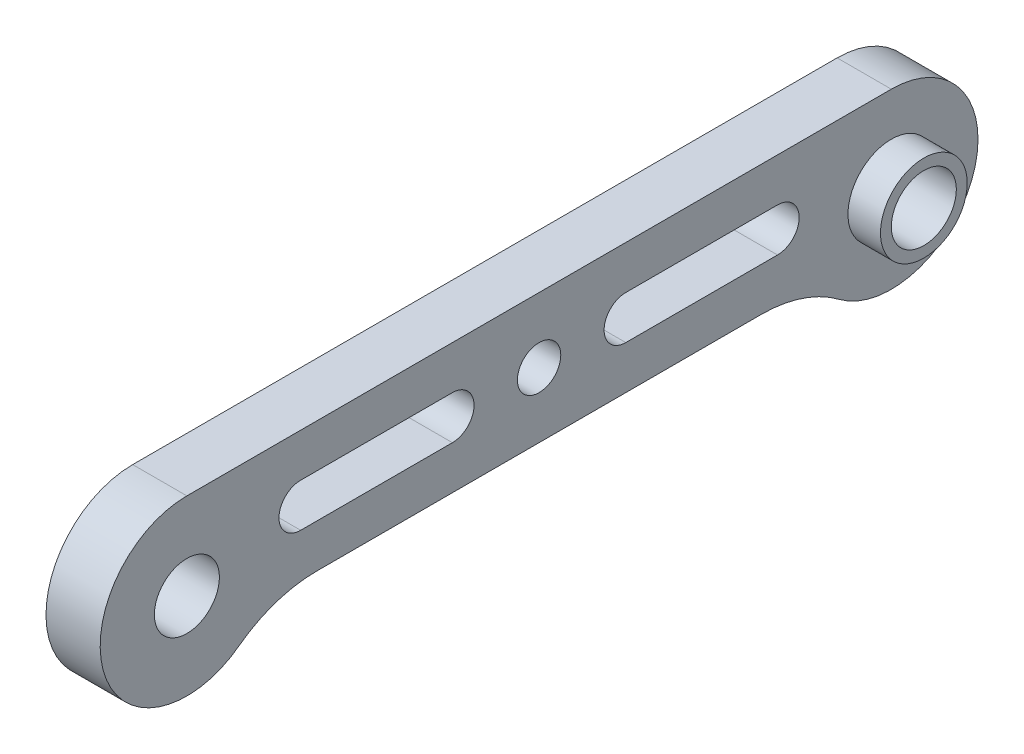
ISO-10303-21;
HEADER;
FILE_DESCRIPTION(('STEP AP214'),'2;1');
FILE_NAME('part.step','',(''),(''),'','','');
FILE_SCHEMA(('AUTOMOTIVE_DESIGN { 1 0 10303 214 1 1 1 1 }'));
ENDSEC;
DATA;
#1=APPLICATION_CONTEXT('core data for automotive mechanical design processes');
#2=APPLICATION_PROTOCOL_DEFINITION('international standard','automotive_design',2000,#1);
#3=PRODUCT_CONTEXT('',#1,'mechanical');
#4=PRODUCT('Part','Part','',(#3));
#5=PRODUCT_RELATED_PRODUCT_CATEGORY('part','',(#4));
#6=PRODUCT_DEFINITION_FORMATION('','',#4);
#7=PRODUCT_DEFINITION_CONTEXT('part definition',#1,'design');
#8=PRODUCT_DEFINITION('design','',#6,#7);
#9=PRODUCT_DEFINITION_SHAPE('','',#8);
#10=(LENGTH_UNIT() NAMED_UNIT(*) SI_UNIT(.MILLI.,.METRE.));
#11=(NAMED_UNIT(*) PLANE_ANGLE_UNIT() SI_UNIT($,.RADIAN.));
#12=(NAMED_UNIT(*) SI_UNIT($,.STERADIAN.) SOLID_ANGLE_UNIT());
#13=UNCERTAINTY_MEASURE_WITH_UNIT(LENGTH_MEASURE(1.E-05),#10,'distance_accuracy_value','');
#14=(GEOMETRIC_REPRESENTATION_CONTEXT(3) GLOBAL_UNCERTAINTY_ASSIGNED_CONTEXT((#13)) GLOBAL_UNIT_ASSIGNED_CONTEXT((#10,
#11,#12)) REPRESENTATION_CONTEXT('',''));
#15=CARTESIAN_POINT('',(0.,0.,0.));
#16=DIRECTION('',(0.,0.,1.));
#17=DIRECTION('',(1.,0.,0.));
#18=AXIS2_PLACEMENT_3D('',#15,#16,#17);
#19=CARTESIAN_POINT('',(5.,0.,0.));
#20=DIRECTION('',(1.,0.,0.));
#21=DIRECTION('',(0.,0.,-1.));
#22=AXIS2_PLACEMENT_3D('',#19,#20,#21);
#23=PLANE('',#22);
#24=DIRECTION('',(0.,0.,1.));
#25=VECTOR('',#24,1.);
#26=CARTESIAN_POINT('',(5.,-4.,0.));
#27=LINE('',#26,#25);
#28=CARTESIAN_POINT('',(5.,-4.,12.));
#29=VERTEX_POINT('',#28);
#30=CARTESIAN_POINT('',(5.,-4.00000000000001,53.));
#31=VERTEX_POINT('',#30);
#32=EDGE_CURVE('E239',#29,#31,#27,.T.);
#33=ORIENTED_EDGE('',*,*,#32,.F.);
#34=CARTESIAN_POINT('',(5.,-16.,12.));
#35=DIRECTION('',(1.,0.,0.));
#36=DIRECTION('',(0.,0.,-1.));
#37=AXIS2_PLACEMENT_3D('',#34,#35,#36);
#38=CIRCLE('',#37,12.);
#39=CARTESIAN_POINT('',(5.,-6.4,4.8));
#40=VERTEX_POINT('',#39);
#41=EDGE_CURVE('E296',#29,#40,#38,.F.);
#42=ORIENTED_EDGE('',*,*,#41,.T.);
#43=CARTESIAN_POINT('',(5.,0.,0.));
#44=DIRECTION('',(1.,0.,0.));
#45=DIRECTION('',(0.,0.,-1.));
#46=AXIS2_PLACEMENT_3D('',#43,#44,#45);
#47=CIRCLE('',#46,8.);
#48=CARTESIAN_POINT('',(5.,8.,0.));
#49=VERTEX_POINT('',#48);
#50=EDGE_CURVE('E244',#40,#49,#47,.T.);
#51=ORIENTED_EDGE('',*,*,#50,.T.);
#52=DIRECTION('',(0.,0.,-1.));
#53=VECTOR('',#52,1.);
#54=CARTESIAN_POINT('',(5.,8.,0.));
#55=LINE('',#54,#53);
#56=CARTESIAN_POINT('',(5.,7.99999999999999,65.));
#57=VERTEX_POINT('',#56);
#58=EDGE_CURVE('E247',#57,#49,#55,.T.);
#59=ORIENTED_EDGE('',*,*,#58,.F.);
#60=CARTESIAN_POINT('',(5.,0.,65.));
#61=DIRECTION('',(1.,0.,0.));
#62=DIRECTION('',(0.,0.,-1.));
#63=AXIS2_PLACEMENT_3D('',#60,#61,#62);
#64=CIRCLE('',#63,8.);
#65=CARTESIAN_POINT('',(5.,-6.40000000000001,60.2));
#66=VERTEX_POINT('',#65);
#67=EDGE_CURVE('E251',#57,#66,#64,.T.);
#68=ORIENTED_EDGE('',*,*,#67,.T.);
#69=CARTESIAN_POINT('',(5.,-16.,53.));
#70=DIRECTION('',(1.,0.,0.));
#71=DIRECTION('',(0.,0.,-1.));
#72=AXIS2_PLACEMENT_3D('',#69,#70,#71);
#73=CIRCLE('',#72,12.);
#74=EDGE_CURVE('E50',#66,#31,#73,.F.);
#75=ORIENTED_EDGE('',*,*,#74,.T.);
#76=EDGE_LOOP('',(#33,#42,#51,#59,#68,#75));
#77=FACE_BOUND('',#76,.T.);
#78=CARTESIAN_POINT('',(5.,0.,65.));
#79=DIRECTION('',(1.,0.,0.));
#80=DIRECTION('',(0.,0.,-1.));
#81=AXIS2_PLACEMENT_3D('',#78,#79,#80);
#82=CIRCLE('',#81,3.00000000000001);
#83=CARTESIAN_POINT('',(5.,0.,62.));
#84=VERTEX_POINT('',#83);
#85=EDGE_CURVE('E235',#84,#84,#82,.T.);
#86=ORIENTED_EDGE('',*,*,#85,.F.);
#87=EDGE_LOOP('',(#86));
#88=FACE_BOUND('',#87,.T.);
#89=CARTESIAN_POINT('',(5.,1.99999999999999,32.5));
#90=DIRECTION('',(1.,0.,0.));
#91=DIRECTION('',(0.,0.,-1.));
#92=AXIS2_PLACEMENT_3D('',#89,#90,#91);
#93=CIRCLE('',#92,2.);
#94=CARTESIAN_POINT('',(5.,1.99999999999999,30.5));
#95=VERTEX_POINT('',#94);
#96=EDGE_CURVE('E185',#95,#95,#93,.T.);
#97=ORIENTED_EDGE('',*,*,#96,.F.);
#98=EDGE_LOOP('',(#97));
#99=FACE_BOUND('',#98,.T.);
#100=CARTESIAN_POINT('',(5.,1.99999999999999,54.5));
#101=DIRECTION('',(1.,0.,0.));
#102=DIRECTION('',(0.,0.,-1.));
#103=AXIS2_PLACEMENT_3D('',#100,#101,#102);
#104=CIRCLE('',#103,2.);
#105=CARTESIAN_POINT('',(5.,3.99999999999999,54.5));
#106=VERTEX_POINT('',#105);
#107=CARTESIAN_POINT('',(5.,0.,54.5));
#108=VERTEX_POINT('',#107);
#109=EDGE_CURVE('E65',#106,#108,#104,.T.);
#110=ORIENTED_EDGE('',*,*,#109,.F.);
#111=DIRECTION('',(0.,0.,1.));
#112=VECTOR('',#111,1.);
#113=CARTESIAN_POINT('',(5.,3.99999999999999,54.5));
#114=LINE('',#113,#112);
#115=CARTESIAN_POINT('',(5.,3.99999999999999,40.5));
#116=VERTEX_POINT('',#115);
#117=EDGE_CURVE('E168',#116,#106,#114,.T.);
#118=ORIENTED_EDGE('',*,*,#117,.F.);
#119=CARTESIAN_POINT('',(5.,1.99999999999999,40.5));
#120=DIRECTION('',(1.,0.,0.));
#121=DIRECTION('',(0.,0.,-1.));
#122=AXIS2_PLACEMENT_3D('',#119,#120,#121);
#123=CIRCLE('',#122,2.);
#124=CARTESIAN_POINT('',(5.,0.,40.5));
#125=VERTEX_POINT('',#124);
#126=EDGE_CURVE('E150',#125,#116,#123,.T.);
#127=ORIENTED_EDGE('',*,*,#126,.F.);
#128=DIRECTION('',(0.,0.,-1.));
#129=VECTOR('',#128,1.);
#130=CARTESIAN_POINT('',(5.,0.,54.5));
#131=LINE('',#130,#129);
#132=EDGE_CURVE('E161',#108,#125,#131,.T.);
#133=ORIENTED_EDGE('',*,*,#132,.F.);
#134=EDGE_LOOP('',(#110,#118,#127,#133));
#135=FACE_BOUND('',#134,.T.);
#136=CARTESIAN_POINT('',(5.,1.99999999999999,24.5));
#137=DIRECTION('',(1.,0.,0.));
#138=DIRECTION('',(0.,0.,-1.));
#139=AXIS2_PLACEMENT_3D('',#136,#137,#138);
#140=CIRCLE('',#139,2.);
#141=CARTESIAN_POINT('',(5.,3.99999999999999,24.5));
#142=VERTEX_POINT('',#141);
#143=CARTESIAN_POINT('',(5.,0.,24.5));
#144=VERTEX_POINT('',#143);
#145=EDGE_CURVE('E57',#142,#144,#140,.T.);
#146=ORIENTED_EDGE('',*,*,#145,.F.);
#147=DIRECTION('',(0.,0.,1.));
#148=VECTOR('',#147,1.);
#149=CARTESIAN_POINT('',(5.,3.99999999999999,24.5));
#150=LINE('',#149,#148);
#151=CARTESIAN_POINT('',(5.,3.99999999999999,10.5));
#152=VERTEX_POINT('',#151);
#153=EDGE_CURVE('E210',#152,#142,#150,.T.);
#154=ORIENTED_EDGE('',*,*,#153,.F.);
#155=CARTESIAN_POINT('',(5.,1.99999999999999,10.5));
#156=DIRECTION('',(1.,0.,0.));
#157=DIRECTION('',(0.,0.,-1.));
#158=AXIS2_PLACEMENT_3D('',#155,#156,#157);
#159=CIRCLE('',#158,2.);
#160=CARTESIAN_POINT('',(5.,0.,10.5));
#161=VERTEX_POINT('',#160);
#162=EDGE_CURVE('E206',#161,#152,#159,.T.);
#163=ORIENTED_EDGE('',*,*,#162,.F.);
#164=DIRECTION('',(0.,0.,-1.));
#165=VECTOR('',#164,1.);
#166=CARTESIAN_POINT('',(5.,0.,24.5));
#167=LINE('',#166,#165);
#168=EDGE_CURVE('E201',#144,#161,#167,.T.);
#169=ORIENTED_EDGE('',*,*,#168,.F.);
#170=EDGE_LOOP('',(#146,#154,#163,#169));
#171=FACE_BOUND('',#170,.T.);
#172=CARTESIAN_POINT('',(5.,0.,0.));
#173=DIRECTION('',(1.,0.,0.));
#174=DIRECTION('',(0.,0.,-1.));
#175=AXIS2_PLACEMENT_3D('',#172,#173,#174);
#176=CIRCLE('',#175,4.);
#177=CARTESIAN_POINT('',(5.,0.,-4.));
#178=VERTEX_POINT('',#177);
#179=EDGE_CURVE('E373',#178,#178,#176,.T.);
#180=ORIENTED_EDGE('',*,*,#179,.F.);
#181=EDGE_LOOP('',(#180));
#182=FACE_BOUND('',#181,.T.);
#183=ADVANCED_FACE('F41',(#77,#88,#99,#135,#171,#182),#23,.T.);
#184=CARTESIAN_POINT('',(0.,0.,0.));
#185=DIRECTION('',(1.,0.,0.));
#186=DIRECTION('',(0.,0.,-1.));
#187=AXIS2_PLACEMENT_3D('',#184,#185,#186);
#188=PLANE('',#187);
#189=CARTESIAN_POINT('',(0.,0.,0.));
#190=DIRECTION('',(1.,0.,0.));
#191=DIRECTION('',(0.,0.,-1.));
#192=AXIS2_PLACEMENT_3D('',#189,#190,#191);
#193=CIRCLE('',#192,8.);
#194=CARTESIAN_POINT('',(0.,-6.4,4.8));
#195=VERTEX_POINT('',#194);
#196=CARTESIAN_POINT('',(0.,8.,0.));
#197=VERTEX_POINT('',#196);
#198=EDGE_CURVE('E263',#195,#197,#193,.T.);
#199=ORIENTED_EDGE('',*,*,#198,.F.);
#200=CARTESIAN_POINT('',(0.,-16.,12.));
#201=DIRECTION('',(1.,0.,0.));
#202=DIRECTION('',(0.,0.,-1.));
#203=AXIS2_PLACEMENT_3D('',#200,#201,#202);
#204=CIRCLE('',#203,12.);
#205=CARTESIAN_POINT('',(0.,-4.,12.));
#206=VERTEX_POINT('',#205);
#207=EDGE_CURVE('E293',#195,#206,#204,.T.);
#208=ORIENTED_EDGE('',*,*,#207,.T.);
#209=DIRECTION('',(0.,0.,1.));
#210=VECTOR('',#209,1.);
#211=CARTESIAN_POINT('',(0.,-4.,0.));
#212=LINE('',#211,#210);
#213=CARTESIAN_POINT('',(0.,-4.00000000000001,53.));
#214=VERTEX_POINT('',#213);
#215=EDGE_CURVE('E259',#206,#214,#212,.T.);
#216=ORIENTED_EDGE('',*,*,#215,.T.);
#217=CARTESIAN_POINT('',(0.,-16.,53.));
#218=DIRECTION('',(1.,0.,0.));
#219=DIRECTION('',(0.,0.,-1.));
#220=AXIS2_PLACEMENT_3D('',#217,#218,#219);
#221=CIRCLE('',#220,12.);
#222=CARTESIAN_POINT('',(0.,-6.40000000000001,60.2));
#223=VERTEX_POINT('',#222);
#224=EDGE_CURVE('E299',#214,#223,#221,.T.);
#225=ORIENTED_EDGE('',*,*,#224,.T.);
#226=CARTESIAN_POINT('',(0.,0.,65.));
#227=DIRECTION('',(1.,0.,0.));
#228=DIRECTION('',(0.,0.,-1.));
#229=AXIS2_PLACEMENT_3D('',#226,#227,#228);
#230=CIRCLE('',#229,8.);
#231=CARTESIAN_POINT('',(0.,7.99999999999999,65.));
#232=VERTEX_POINT('',#231);
#233=EDGE_CURVE('E240',#232,#223,#230,.T.);
#234=ORIENTED_EDGE('',*,*,#233,.F.);
#235=DIRECTION('',(0.,0.,-1.));
#236=VECTOR('',#235,1.);
#237=CARTESIAN_POINT('',(0.,8.,0.));
#238=LINE('',#237,#236);
#239=EDGE_CURVE('E266',#232,#197,#238,.T.);
#240=ORIENTED_EDGE('',*,*,#239,.T.);
#241=EDGE_LOOP('',(#199,#208,#216,#225,#234,#240));
#242=FACE_BOUND('',#241,.T.);
#243=CARTESIAN_POINT('',(0.,0.,65.));
#244=DIRECTION('',(1.,0.,0.));
#245=DIRECTION('',(0.,0.,-1.));
#246=AXIS2_PLACEMENT_3D('',#243,#244,#245);
#247=CIRCLE('',#246,3.00000000000001);
#248=CARTESIAN_POINT('',(0.,0.,62.));
#249=VERTEX_POINT('',#248);
#250=EDGE_CURVE('E234',#249,#249,#247,.T.);
#251=ORIENTED_EDGE('',*,*,#250,.T.);
#252=EDGE_LOOP('',(#251));
#253=FACE_BOUND('',#252,.T.);
#254=CARTESIAN_POINT('',(0.,1.99999999999999,32.5));
#255=DIRECTION('',(1.,0.,0.));
#256=DIRECTION('',(0.,0.,-1.));
#257=AXIS2_PLACEMENT_3D('',#254,#255,#256);
#258=CIRCLE('',#257,2.);
#259=CARTESIAN_POINT('',(0.,1.99999999999999,30.5));
#260=VERTEX_POINT('',#259);
#261=EDGE_CURVE('E230',#260,#260,#258,.F.);
#262=ORIENTED_EDGE('',*,*,#261,.F.);
#263=EDGE_LOOP('',(#262));
#264=FACE_BOUND('',#263,.T.);
#265=DIRECTION('',(0.,0.,-1.));
#266=VECTOR('',#265,1.);
#267=CARTESIAN_POINT('',(0.,3.99999999999999,54.5));
#268=LINE('',#267,#266);
#269=CARTESIAN_POINT('',(0.,3.99999999999999,54.5));
#270=VERTEX_POINT('',#269);
#271=CARTESIAN_POINT('',(0.,3.99999999999999,40.5));
#272=VERTEX_POINT('',#271);
#273=EDGE_CURVE('E390',#270,#272,#268,.T.);
#274=ORIENTED_EDGE('',*,*,#273,.F.);
#275=CARTESIAN_POINT('',(0.,1.99999999999999,54.5));
#276=DIRECTION('',(1.,0.,0.));
#277=DIRECTION('',(0.,0.,-1.));
#278=AXIS2_PLACEMENT_3D('',#275,#276,#277);
#279=CIRCLE('',#278,2.);
#280=CARTESIAN_POINT('',(0.,0.,54.5));
#281=VERTEX_POINT('',#280);
#282=EDGE_CURVE('E186',#281,#270,#279,.F.);
#283=ORIENTED_EDGE('',*,*,#282,.F.);
#284=DIRECTION('',(0.,0.,1.));
#285=VECTOR('',#284,1.);
#286=CARTESIAN_POINT('',(0.,0.,54.5));
#287=LINE('',#286,#285);
#288=CARTESIAN_POINT('',(0.,0.,40.5));
#289=VERTEX_POINT('',#288);
#290=EDGE_CURVE('E182',#289,#281,#287,.T.);
#291=ORIENTED_EDGE('',*,*,#290,.F.);
#292=CARTESIAN_POINT('',(0.,1.99999999999999,40.5));
#293=DIRECTION('',(1.,0.,0.));
#294=DIRECTION('',(0.,0.,-1.));
#295=AXIS2_PLACEMENT_3D('',#292,#293,#294);
#296=CIRCLE('',#295,2.);
#297=EDGE_CURVE('E153',#272,#289,#296,.F.);
#298=ORIENTED_EDGE('',*,*,#297,.F.);
#299=EDGE_LOOP('',(#274,#283,#291,#298));
#300=FACE_BOUND('',#299,.T.);
#301=DIRECTION('',(0.,0.,-1.));
#302=VECTOR('',#301,1.);
#303=CARTESIAN_POINT('',(0.,3.99999999999999,24.5));
#304=LINE('',#303,#302);
#305=CARTESIAN_POINT('',(0.,3.99999999999999,24.5));
#306=VERTEX_POINT('',#305);
#307=CARTESIAN_POINT('',(0.,3.99999999999999,10.5));
#308=VERTEX_POINT('',#307);
#309=EDGE_CURVE('E191',#306,#308,#304,.T.);
#310=ORIENTED_EDGE('',*,*,#309,.F.);
#311=CARTESIAN_POINT('',(0.,1.99999999999999,24.5));
#312=DIRECTION('',(1.,0.,0.));
#313=DIRECTION('',(0.,0.,-1.));
#314=AXIS2_PLACEMENT_3D('',#311,#312,#313);
#315=CIRCLE('',#314,2.);
#316=CARTESIAN_POINT('',(0.,0.,24.5));
#317=VERTEX_POINT('',#316);
#318=EDGE_CURVE('E195',#317,#306,#315,.F.);
#319=ORIENTED_EDGE('',*,*,#318,.F.);
#320=DIRECTION('',(0.,0.,1.));
#321=VECTOR('',#320,1.);
#322=CARTESIAN_POINT('',(0.,0.,24.5));
#323=LINE('',#322,#321);
#324=CARTESIAN_POINT('',(0.,0.,10.5));
#325=VERTEX_POINT('',#324);
#326=EDGE_CURVE('E198',#325,#317,#323,.T.);
#327=ORIENTED_EDGE('',*,*,#326,.F.);
#328=CARTESIAN_POINT('',(0.,1.99999999999999,10.5));
#329=DIRECTION('',(1.,0.,0.));
#330=DIRECTION('',(0.,0.,-1.));
#331=AXIS2_PLACEMENT_3D('',#328,#329,#330);
#332=CIRCLE('',#331,2.);
#333=EDGE_CURVE('E187',#308,#325,#332,.F.);
#334=ORIENTED_EDGE('',*,*,#333,.F.);
#335=EDGE_LOOP('',(#310,#319,#327,#334));
#336=FACE_BOUND('',#335,.T.);
#337=CARTESIAN_POINT('',(0.,0.,0.));
#338=DIRECTION('',(1.,0.,0.));
#339=DIRECTION('',(0.,0.,-1.));
#340=AXIS2_PLACEMENT_3D('',#337,#338,#339);
#341=CIRCLE('',#340,4.);
#342=CARTESIAN_POINT('',(0.,0.,-4.));
#343=VERTEX_POINT('',#342);
#344=EDGE_CURVE('E11',#343,#343,#341,.F.);
#345=ORIENTED_EDGE('',*,*,#344,.F.);
#346=EDGE_LOOP('',(#345));
#347=FACE_BOUND('',#346,.T.);
#348=ADVANCED_FACE('F319',(#242,#253,#264,#300,#336,#347),#188,.F.);
#349=CARTESIAN_POINT('',(5.,-4.,0.));
#350=DIRECTION('',(0.,-1.,0.));
#351=DIRECTION('',(0.,0.,-1.));
#352=AXIS2_PLACEMENT_3D('',#349,#350,#351);
#353=PLANE('',#352);
#354=ORIENTED_EDGE('',*,*,#215,.F.);
#355=DIRECTION('',(-1.,0.,0.));
#356=VECTOR('',#355,1.);
#357=CARTESIAN_POINT('',(5.,-4.,12.));
#358=LINE('',#357,#356);
#359=EDGE_CURVE('E287',#206,#29,#358,.F.);
#360=ORIENTED_EDGE('',*,*,#359,.T.);
#361=ORIENTED_EDGE('',*,*,#32,.T.);
#362=DIRECTION('',(-1.,0.,0.));
#363=VECTOR('',#362,1.);
#364=CARTESIAN_POINT('',(5.,-4.00000000000001,53.));
#365=LINE('',#364,#363);
#366=EDGE_CURVE('E283',#31,#214,#365,.T.);
#367=ORIENTED_EDGE('',*,*,#366,.T.);
#368=EDGE_LOOP('',(#354,#360,#361,#367));
#369=FACE_BOUND('',#368,.T.);
#370=ADVANCED_FACE('F314',(#369),#353,.T.);
#371=CARTESIAN_POINT('',(5.,0.,0.));
#372=DIRECTION('',(-1.,0.,0.));
#373=DIRECTION('',(0.,0.,1.));
#374=AXIS2_PLACEMENT_3D('',#371,#372,#373);
#375=CYLINDRICAL_SURFACE('',#374,8.);
#376=ORIENTED_EDGE('',*,*,#50,.F.);
#377=DIRECTION('',(-1.,0.,0.));
#378=VECTOR('',#377,1.);
#379=CARTESIAN_POINT('',(5.,-6.4,4.8));
#380=LINE('',#379,#378);
#381=EDGE_CURVE('E279',#40,#195,#380,.T.);
#382=ORIENTED_EDGE('',*,*,#381,.T.);
#383=ORIENTED_EDGE('',*,*,#198,.T.);
#384=DIRECTION('',(-1.,0.,0.));
#385=VECTOR('',#384,1.);
#386=CARTESIAN_POINT('',(5.,8.,0.));
#387=LINE('',#386,#385);
#388=EDGE_CURVE('E275',#49,#197,#387,.T.);
#389=ORIENTED_EDGE('',*,*,#388,.F.);
#390=EDGE_LOOP('',(#376,#382,#383,#389));
#391=FACE_BOUND('',#390,.T.);
#392=ADVANCED_FACE('F329',(#391),#375,.T.);
#393=CARTESIAN_POINT('',(5.,8.,0.));
#394=DIRECTION('',(0.,1.,0.));
#395=DIRECTION('',(0.,0.,1.));
#396=AXIS2_PLACEMENT_3D('',#393,#394,#395);
#397=PLANE('',#396);
#398=ORIENTED_EDGE('',*,*,#239,.F.);
#399=DIRECTION('',(-1.,0.,0.));
#400=VECTOR('',#399,1.);
#401=CARTESIAN_POINT('',(5.,7.99999999999999,65.));
#402=LINE('',#401,#400);
#403=EDGE_CURVE('E255',#57,#232,#402,.T.);
#404=ORIENTED_EDGE('',*,*,#403,.F.);
#405=ORIENTED_EDGE('',*,*,#58,.T.);
#406=ORIENTED_EDGE('',*,*,#388,.T.);
#407=EDGE_LOOP('',(#398,#404,#405,#406));
#408=FACE_BOUND('',#407,.T.);
#409=ADVANCED_FACE('F325',(#408),#397,.T.);
#410=CARTESIAN_POINT('',(5.,0.,65.));
#411=DIRECTION('',(-1.,0.,0.));
#412=DIRECTION('',(0.,0.,1.));
#413=AXIS2_PLACEMENT_3D('',#410,#411,#412);
#414=CYLINDRICAL_SURFACE('',#413,3.00000000000001);
#415=ORIENTED_EDGE('',*,*,#85,.T.);
#416=EDGE_LOOP('',(#415));
#417=FACE_BOUND('',#416,.T.);
#418=ORIENTED_EDGE('',*,*,#250,.F.);
#419=EDGE_LOOP('',(#418));
#420=FACE_BOUND('',#419,.T.);
#421=ADVANCED_FACE('F353',(#417,#420),#414,.F.);
#422=CARTESIAN_POINT('',(5.,0.,0.));
#423=DIRECTION('',(-1.,0.,0.));
#424=DIRECTION('',(0.,0.,1.));
#425=AXIS2_PLACEMENT_3D('',#422,#423,#424);
#426=CYLINDRICAL_SURFACE('',#425,3.);
#427=CARTESIAN_POINT('',(-3.,0.,0.));
#428=DIRECTION('',(-1.,0.,0.));
#429=DIRECTION('',(0.,0.,1.));
#430=AXIS2_PLACEMENT_3D('',#427,#428,#429);
#431=CIRCLE('',#430,3.);
#432=CARTESIAN_POINT('',(-3.,0.,3.));
#433=VERTEX_POINT('',#432);
#434=EDGE_CURVE('E367',#433,#433,#431,.T.);
#435=ORIENTED_EDGE('',*,*,#434,.T.);
#436=EDGE_LOOP('',(#435));
#437=FACE_BOUND('',#436,.T.);
#438=CARTESIAN_POINT('',(8.,0.,0.));
#439=DIRECTION('',(1.,0.,0.));
#440=DIRECTION('',(0.,0.,-1.));
#441=AXIS2_PLACEMENT_3D('',#438,#439,#440);
#442=CIRCLE('',#441,3.);
#443=CARTESIAN_POINT('',(8.,0.,-3.));
#444=VERTEX_POINT('',#443);
#445=EDGE_CURVE('E370',#444,#444,#442,.T.);
#446=ORIENTED_EDGE('',*,*,#445,.T.);
#447=EDGE_LOOP('',(#446));
#448=FACE_BOUND('',#447,.T.);
#449=ADVANCED_FACE('F339',(#437,#448),#426,.F.);
#450=CARTESIAN_POINT('',(5.,0.,65.));
#451=DIRECTION('',(-1.,0.,0.));
#452=DIRECTION('',(0.,0.,1.));
#453=AXIS2_PLACEMENT_3D('',#450,#451,#452);
#454=CYLINDRICAL_SURFACE('',#453,8.);
#455=ORIENTED_EDGE('',*,*,#233,.T.);
#456=DIRECTION('',(-1.,0.,0.));
#457=VECTOR('',#456,1.);
#458=CARTESIAN_POINT('',(5.,-6.40000000000001,60.2));
#459=LINE('',#458,#457);
#460=EDGE_CURVE('E290',#223,#66,#459,.F.);
#461=ORIENTED_EDGE('',*,*,#460,.T.);
#462=ORIENTED_EDGE('',*,*,#67,.F.);
#463=ORIENTED_EDGE('',*,*,#403,.T.);
#464=EDGE_LOOP('',(#455,#461,#462,#463));
#465=FACE_BOUND('',#464,.T.);
#466=ADVANCED_FACE('F323',(#465),#454,.T.);
#467=CARTESIAN_POINT('',(5.,-16.,12.));
#468=DIRECTION('',(-1.,0.,0.));
#469=DIRECTION('',(0.,0.,1.));
#470=AXIS2_PLACEMENT_3D('',#467,#468,#469);
#471=CYLINDRICAL_SURFACE('',#470,12.);
#472=ORIENTED_EDGE('',*,*,#41,.F.);
#473=ORIENTED_EDGE('',*,*,#359,.F.);
#474=ORIENTED_EDGE('',*,*,#207,.F.);
#475=ORIENTED_EDGE('',*,*,#381,.F.);
#476=EDGE_LOOP('',(#472,#473,#474,#475));
#477=FACE_BOUND('',#476,.T.);
#478=ADVANCED_FACE('F332',(#477),#471,.F.);
#479=CARTESIAN_POINT('',(5.,-16.,53.));
#480=DIRECTION('',(-1.,0.,0.));
#481=DIRECTION('',(0.,0.,1.));
#482=AXIS2_PLACEMENT_3D('',#479,#480,#481);
#483=CYLINDRICAL_SURFACE('',#482,12.);
#484=ORIENTED_EDGE('',*,*,#74,.F.);
#485=ORIENTED_EDGE('',*,*,#460,.F.);
#486=ORIENTED_EDGE('',*,*,#224,.F.);
#487=ORIENTED_EDGE('',*,*,#366,.F.);
#488=EDGE_LOOP('',(#484,#485,#486,#487));
#489=FACE_BOUND('',#488,.T.);
#490=ADVANCED_FACE('F43',(#489),#483,.F.);
#491=CARTESIAN_POINT('',(-18.4390889145858,1.99999999999999,32.5));
#492=DIRECTION('',(1.,0.,0.));
#493=DIRECTION('',(0.,0.,-1.));
#494=AXIS2_PLACEMENT_3D('',#491,#492,#493);
#495=CYLINDRICAL_SURFACE('',#494,2.);
#496=ORIENTED_EDGE('',*,*,#261,.T.);
#497=EDGE_LOOP('',(#496));
#498=FACE_BOUND('',#497,.T.);
#499=ORIENTED_EDGE('',*,*,#96,.T.);
#500=EDGE_LOOP('',(#499));
#501=FACE_BOUND('',#500,.T.);
#502=ADVANCED_FACE('F338',(#498,#501),#495,.F.);
#503=CARTESIAN_POINT('',(-18.4390889145858,1.99999999999999,54.5));
#504=DIRECTION('',(1.,0.,0.));
#505=DIRECTION('',(0.,0.,-1.));
#506=AXIS2_PLACEMENT_3D('',#503,#504,#505);
#507=CYLINDRICAL_SURFACE('',#506,2.);
#508=ORIENTED_EDGE('',*,*,#282,.T.);
#509=DIRECTION('',(1.,0.,0.));
#510=VECTOR('',#509,1.);
#511=CARTESIAN_POINT('',(-18.4390889145858,3.99999999999999,54.5));
#512=LINE('',#511,#510);
#513=EDGE_CURVE('E175',#270,#106,#512,.T.);
#514=ORIENTED_EDGE('',*,*,#513,.T.);
#515=ORIENTED_EDGE('',*,*,#109,.T.);
#516=DIRECTION('',(1.,0.,0.));
#517=VECTOR('',#516,1.);
#518=CARTESIAN_POINT('',(-18.4390889145858,0.,54.5));
#519=LINE('',#518,#517);
#520=EDGE_CURVE('E158',#281,#108,#519,.T.);
#521=ORIENTED_EDGE('',*,*,#520,.F.);
#522=EDGE_LOOP('',(#508,#514,#515,#521));
#523=FACE_BOUND('',#522,.T.);
#524=ADVANCED_FACE('F397',(#523),#507,.F.);
#525=CARTESIAN_POINT('',(-18.4390889145858,3.99999999999999,54.5));
#526=DIRECTION('',(0.,1.,0.));
#527=DIRECTION('',(0.,0.,1.));
#528=AXIS2_PLACEMENT_3D('',#525,#526,#527);
#529=PLANE('',#528);
#530=ORIENTED_EDGE('',*,*,#273,.T.);
#531=DIRECTION('',(1.,0.,0.));
#532=VECTOR('',#531,1.);
#533=CARTESIAN_POINT('',(-18.4390889145858,3.99999999999999,40.5));
#534=LINE('',#533,#532);
#535=EDGE_CURVE('E157',#272,#116,#534,.T.);
#536=ORIENTED_EDGE('',*,*,#535,.T.);
#537=ORIENTED_EDGE('',*,*,#117,.T.);
#538=ORIENTED_EDGE('',*,*,#513,.F.);
#539=EDGE_LOOP('',(#530,#536,#537,#538));
#540=FACE_BOUND('',#539,.T.);
#541=ADVANCED_FACE('F401',(#540),#529,.F.);
#542=CARTESIAN_POINT('',(-18.4390889145858,1.99999999999999,40.5));
#543=DIRECTION('',(1.,0.,0.));
#544=DIRECTION('',(0.,0.,-1.));
#545=AXIS2_PLACEMENT_3D('',#542,#543,#544);
#546=CYLINDRICAL_SURFACE('',#545,2.);
#547=ORIENTED_EDGE('',*,*,#297,.T.);
#548=DIRECTION('',(1.,0.,0.));
#549=VECTOR('',#548,1.);
#550=CARTESIAN_POINT('',(-18.4390889145858,0.,40.5));
#551=LINE('',#550,#549);
#552=EDGE_CURVE('E145',#289,#125,#551,.T.);
#553=ORIENTED_EDGE('',*,*,#552,.T.);
#554=ORIENTED_EDGE('',*,*,#126,.T.);
#555=ORIENTED_EDGE('',*,*,#535,.F.);
#556=EDGE_LOOP('',(#547,#553,#554,#555));
#557=FACE_BOUND('',#556,.T.);
#558=ADVANCED_FACE('F147',(#557),#546,.F.);
#559=CARTESIAN_POINT('',(-18.4390889145858,0.,54.5));
#560=DIRECTION('',(0.,-1.,0.));
#561=DIRECTION('',(0.,0.,-1.));
#562=AXIS2_PLACEMENT_3D('',#559,#560,#561);
#563=PLANE('',#562);
#564=ORIENTED_EDGE('',*,*,#290,.T.);
#565=ORIENTED_EDGE('',*,*,#520,.T.);
#566=ORIENTED_EDGE('',*,*,#132,.T.);
#567=ORIENTED_EDGE('',*,*,#552,.F.);
#568=EDGE_LOOP('',(#564,#565,#566,#567));
#569=FACE_BOUND('',#568,.T.);
#570=ADVANCED_FACE('F162',(#569),#563,.F.);
#571=CARTESIAN_POINT('',(-18.4390889145858,1.99999999999999,24.5));
#572=DIRECTION('',(1.,0.,0.));
#573=DIRECTION('',(0.,0.,-1.));
#574=AXIS2_PLACEMENT_3D('',#571,#572,#573);
#575=CYLINDRICAL_SURFACE('',#574,2.);
#576=ORIENTED_EDGE('',*,*,#318,.T.);
#577=DIRECTION('',(1.,0.,0.));
#578=VECTOR('',#577,1.);
#579=CARTESIAN_POINT('',(-18.4390889145858,3.99999999999999,24.5));
#580=LINE('',#579,#578);
#581=EDGE_CURVE('E192',#306,#142,#580,.T.);
#582=ORIENTED_EDGE('',*,*,#581,.T.);
#583=ORIENTED_EDGE('',*,*,#145,.T.);
#584=DIRECTION('',(1.,0.,0.));
#585=VECTOR('',#584,1.);
#586=CARTESIAN_POINT('',(-18.4390889145858,0.,24.5));
#587=LINE('',#586,#585);
#588=EDGE_CURVE('E214',#317,#144,#587,.T.);
#589=ORIENTED_EDGE('',*,*,#588,.F.);
#590=EDGE_LOOP('',(#576,#582,#583,#589));
#591=FACE_BOUND('',#590,.T.);
#592=ADVANCED_FACE('F434',(#591),#575,.F.);
#593=CARTESIAN_POINT('',(-18.4390889145858,3.99999999999999,24.5));
#594=DIRECTION('',(0.,1.,0.));
#595=DIRECTION('',(0.,0.,1.));
#596=AXIS2_PLACEMENT_3D('',#593,#594,#595);
#597=PLANE('',#596);
#598=ORIENTED_EDGE('',*,*,#309,.T.);
#599=DIRECTION('',(1.,0.,0.));
#600=VECTOR('',#599,1.);
#601=CARTESIAN_POINT('',(-18.4390889145858,3.99999999999999,10.5));
#602=LINE('',#601,#600);
#603=EDGE_CURVE('E217',#308,#152,#602,.T.);
#604=ORIENTED_EDGE('',*,*,#603,.T.);
#605=ORIENTED_EDGE('',*,*,#153,.T.);
#606=ORIENTED_EDGE('',*,*,#581,.F.);
#607=EDGE_LOOP('',(#598,#604,#605,#606));
#608=FACE_BOUND('',#607,.T.);
#609=ADVANCED_FACE('F437',(#608),#597,.F.);
#610=CARTESIAN_POINT('',(-18.4390889145858,1.99999999999999,10.5));
#611=DIRECTION('',(1.,0.,0.));
#612=DIRECTION('',(0.,0.,-1.));
#613=AXIS2_PLACEMENT_3D('',#610,#611,#612);
#614=CYLINDRICAL_SURFACE('',#613,2.);
#615=ORIENTED_EDGE('',*,*,#333,.T.);
#616=DIRECTION('',(1.,0.,0.));
#617=VECTOR('',#616,1.);
#618=CARTESIAN_POINT('',(-18.4390889145858,0.,10.5));
#619=LINE('',#618,#617);
#620=EDGE_CURVE('E220',#325,#161,#619,.T.);
#621=ORIENTED_EDGE('',*,*,#620,.T.);
#622=ORIENTED_EDGE('',*,*,#162,.T.);
#623=ORIENTED_EDGE('',*,*,#603,.F.);
#624=EDGE_LOOP('',(#615,#621,#622,#623));
#625=FACE_BOUND('',#624,.T.);
#626=ADVANCED_FACE('F440',(#625),#614,.F.);
#627=CARTESIAN_POINT('',(-18.4390889145858,0.,24.5));
#628=DIRECTION('',(0.,-1.,0.));
#629=DIRECTION('',(0.,0.,-1.));
#630=AXIS2_PLACEMENT_3D('',#627,#628,#629);
#631=PLANE('',#630);
#632=ORIENTED_EDGE('',*,*,#326,.T.);
#633=ORIENTED_EDGE('',*,*,#588,.T.);
#634=ORIENTED_EDGE('',*,*,#168,.T.);
#635=ORIENTED_EDGE('',*,*,#620,.F.);
#636=EDGE_LOOP('',(#632,#633,#634,#635));
#637=FACE_BOUND('',#636,.T.);
#638=ADVANCED_FACE('F422',(#637),#631,.F.);
#639=CARTESIAN_POINT('',(-3.,0.,0.));
#640=DIRECTION('',(-1.,0.,0.));
#641=DIRECTION('',(0.,0.,1.));
#642=AXIS2_PLACEMENT_3D('',#639,#640,#641);
#643=PLANE('',#642);
#644=CARTESIAN_POINT('',(-3.,0.,0.));
#645=DIRECTION('',(-1.,0.,0.));
#646=DIRECTION('',(0.,0.,1.));
#647=AXIS2_PLACEMENT_3D('',#644,#645,#646);
#648=CIRCLE('',#647,4.);
#649=CARTESIAN_POINT('',(-3.,0.,4.));
#650=VERTEX_POINT('',#649);
#651=EDGE_CURVE('E202',#650,#650,#648,.T.);
#652=ORIENTED_EDGE('',*,*,#651,.T.);
#653=EDGE_LOOP('',(#652));
#654=FACE_BOUND('',#653,.T.);
#655=ORIENTED_EDGE('',*,*,#434,.F.);
#656=EDGE_LOOP('',(#655));
#657=FACE_BOUND('',#656,.T.);
#658=ADVANCED_FACE('F412',(#654,#657),#643,.T.);
#659=CARTESIAN_POINT('',(-3.,0.,0.));
#660=DIRECTION('',(1.,0.,0.));
#661=DIRECTION('',(0.,0.,-1.));
#662=AXIS2_PLACEMENT_3D('',#659,#660,#661);
#663=CYLINDRICAL_SURFACE('',#662,4.);
#664=ORIENTED_EDGE('',*,*,#651,.F.);
#665=EDGE_LOOP('',(#664));
#666=FACE_BOUND('',#665,.T.);
#667=ORIENTED_EDGE('',*,*,#344,.T.);
#668=EDGE_LOOP('',(#667));
#669=FACE_BOUND('',#668,.T.);
#670=ADVANCED_FACE('F409',(#666,#669),#663,.T.);
#671=CARTESIAN_POINT('',(8.,0.,0.));
#672=DIRECTION('',(1.,0.,0.));
#673=DIRECTION('',(0.,0.,-1.));
#674=AXIS2_PLACEMENT_3D('',#671,#672,#673);
#675=PLANE('',#674);
#676=CARTESIAN_POINT('',(8.,0.,0.));
#677=DIRECTION('',(1.,0.,0.));
#678=DIRECTION('',(0.,0.,-1.));
#679=AXIS2_PLACEMENT_3D('',#676,#677,#678);
#680=CIRCLE('',#679,4.);
#681=CARTESIAN_POINT('',(8.,0.,-4.));
#682=VERTEX_POINT('',#681);
#683=EDGE_CURVE('E377',#682,#682,#680,.T.);
#684=ORIENTED_EDGE('',*,*,#683,.T.);
#685=EDGE_LOOP('',(#684));
#686=FACE_BOUND('',#685,.T.);
#687=ORIENTED_EDGE('',*,*,#445,.F.);
#688=EDGE_LOOP('',(#687));
#689=FACE_BOUND('',#688,.T.);
#690=ADVANCED_FACE('F411',(#686,#689),#675,.T.);
#691=CARTESIAN_POINT('',(8.,0.,0.));
#692=DIRECTION('',(-1.,0.,0.));
#693=DIRECTION('',(0.,0.,1.));
#694=AXIS2_PLACEMENT_3D('',#691,#692,#693);
#695=CYLINDRICAL_SURFACE('',#694,4.);
#696=ORIENTED_EDGE('',*,*,#683,.F.);
#697=EDGE_LOOP('',(#696));
#698=FACE_BOUND('',#697,.T.);
#699=ORIENTED_EDGE('',*,*,#179,.T.);
#700=EDGE_LOOP('',(#699));
#701=FACE_BOUND('',#700,.T.);
#702=ADVANCED_FACE('F419',(#698,#701),#695,.T.);
#703=CLOSED_SHELL('',(#183,#348,#370,#392,#409,#421,#449,#466,#478,#490,#502,#524,#541,#558,
#570,#592,#609,#626,#638,#658,#670,#690,#702));
#704=MANIFOLD_SOLID_BREP('B2',#703);
#705=ADVANCED_BREP_SHAPE_REPRESENTATION('',(#18,#704),#14);
#706=SHAPE_DEFINITION_REPRESENTATION(#9,#705);
ENDSEC;
END-ISO-10303-21;
